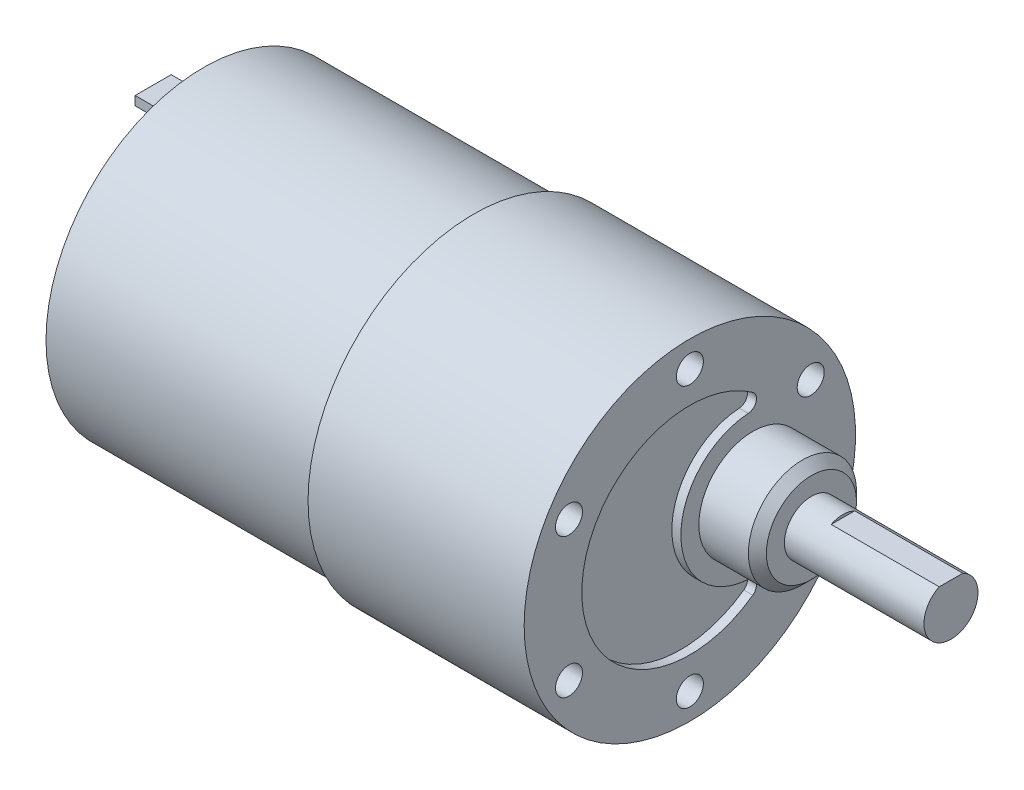
ISO-10303-21;
HEADER;
FILE_DESCRIPTION(('STEP AP214'),'2;1');
FILE_NAME('part.step','',(''),(''),'','','');
FILE_SCHEMA(('AUTOMOTIVE_DESIGN { 1 0 10303 214 1 1 1 1 }'));
ENDSEC;
DATA;
#1=APPLICATION_CONTEXT('core data for automotive mechanical design processes');
#2=APPLICATION_PROTOCOL_DEFINITION('international standard','automotive_design',2000,#1);
#3=PRODUCT_CONTEXT('',#1,'mechanical');
#4=PRODUCT('Part','Part','',(#3));
#5=PRODUCT_RELATED_PRODUCT_CATEGORY('part','',(#4));
#6=PRODUCT_DEFINITION_FORMATION('','',#4);
#7=PRODUCT_DEFINITION_CONTEXT('part definition',#1,'design');
#8=PRODUCT_DEFINITION('design','',#6,#7);
#9=PRODUCT_DEFINITION_SHAPE('','',#8);
#10=(LENGTH_UNIT() NAMED_UNIT(*) SI_UNIT(.MILLI.,.METRE.));
#11=(NAMED_UNIT(*) PLANE_ANGLE_UNIT() SI_UNIT($,.RADIAN.));
#12=(NAMED_UNIT(*) SI_UNIT($,.STERADIAN.) SOLID_ANGLE_UNIT());
#13=UNCERTAINTY_MEASURE_WITH_UNIT(LENGTH_MEASURE(1.E-05),#10,'distance_accuracy_value','');
#14=(GEOMETRIC_REPRESENTATION_CONTEXT(3) GLOBAL_UNCERTAINTY_ASSIGNED_CONTEXT((#13)) GLOBAL_UNIT_ASSIGNED_CONTEXT((#10,
#11,#12)) REPRESENTATION_CONTEXT('',''));
#15=CARTESIAN_POINT('',(0.,0.,0.));
#16=DIRECTION('',(0.,0.,1.));
#17=DIRECTION('',(1.,0.,0.));
#18=AXIS2_PLACEMENT_3D('',#15,#16,#17);
#19=CARTESIAN_POINT('',(54.,0.,-7.));
#20=DIRECTION('',(-1.,0.,0.));
#21=DIRECTION('',(0.,0.,1.));
#22=AXIS2_PLACEMENT_3D('',#19,#20,#21);
#23=CYLINDRICAL_SURFACE('',#22,3.);
#24=CARTESIAN_POINT('',(60.5,0.,-7.));
#25=DIRECTION('',(-1.,0.,0.));
#26=DIRECTION('',(0.,0.,1.));
#27=AXIS2_PLACEMENT_3D('',#24,#25,#26);
#28=CIRCLE('',#27,3.);
#29=CARTESIAN_POINT('',(60.5,0.,-4.));
#30=VERTEX_POINT('',#29);
#31=EDGE_CURVE('E254',#30,#30,#28,.T.);
#32=ORIENTED_EDGE('',*,*,#31,.F.);
#33=EDGE_LOOP('',(#32));
#34=FACE_BOUND('',#33,.T.);
#35=CARTESIAN_POINT('',(64.,0.,-7.));
#36=DIRECTION('',(1.,0.,0.));
#37=DIRECTION('',(0.,0.,-1.));
#38=AXIS2_PLACEMENT_3D('',#35,#36,#37);
#39=CIRCLE('',#38,3.);
#40=CARTESIAN_POINT('',(64.,2.7,-8.3076696830622));
#41=VERTEX_POINT('',#40);
#42=CARTESIAN_POINT('',(64.,2.7,-5.6923303169378));
#43=VERTEX_POINT('',#42);
#44=EDGE_CURVE('E12',#41,#43,#39,.T.);
#45=ORIENTED_EDGE('',*,*,#44,.F.);
#46=DIRECTION('',(1.,0.,0.));
#47=VECTOR('',#46,1.);
#48=CARTESIAN_POINT('',(64.,2.7,-8.3076696830622));
#49=LINE('',#48,#47);
#50=CARTESIAN_POINT('',(76.,2.7,-8.3076696830622));
#51=VERTEX_POINT('',#50);
#52=EDGE_CURVE('E134',#41,#51,#49,.T.);
#53=ORIENTED_EDGE('',*,*,#52,.T.);
#54=CARTESIAN_POINT('',(76.,0.,-7.));
#55=DIRECTION('',(-1.,0.,0.));
#56=DIRECTION('',(0.,0.,1.));
#57=AXIS2_PLACEMENT_3D('',#54,#55,#56);
#58=CIRCLE('',#57,3.);
#59=CARTESIAN_POINT('',(76.,2.7,-5.6923303169378));
#60=VERTEX_POINT('',#59);
#61=EDGE_CURVE('E147',#51,#60,#58,.T.);
#62=ORIENTED_EDGE('',*,*,#61,.T.);
#63=DIRECTION('',(1.,0.,0.));
#64=VECTOR('',#63,1.);
#65=CARTESIAN_POINT('',(64.,2.7,-5.6923303169378));
#66=LINE('',#65,#64);
#67=EDGE_CURVE('E49',#43,#60,#66,.T.);
#68=ORIENTED_EDGE('',*,*,#67,.F.);
#69=EDGE_LOOP('',(#45,#53,#62,#68));
#70=FACE_BOUND('',#69,.T.);
#71=ADVANCED_FACE('F34',(#34,#70),#23,.T.);
#72=CARTESIAN_POINT('',(76.,0.,-7.));
#73=DIRECTION('',(-1.,0.,0.));
#74=DIRECTION('',(0.,0.,1.));
#75=AXIS2_PLACEMENT_3D('',#72,#73,#74);
#76=PLANE('',#75);
#77=DIRECTION('',(0.,0.,1.));
#78=VECTOR('',#77,1.);
#79=CARTESIAN_POINT('',(76.,2.7,-5.6923303169378));
#80=LINE('',#79,#78);
#81=EDGE_CURVE('E138',#51,#60,#80,.T.);
#82=ORIENTED_EDGE('',*,*,#81,.T.);
#83=ORIENTED_EDGE('',*,*,#61,.F.);
#84=EDGE_LOOP('',(#82,#83));
#85=FACE_BOUND('',#84,.T.);
#86=ADVANCED_FACE('F327',(#85),#76,.F.);
#87=CARTESIAN_POINT('',(0.,0.,0.));
#88=DIRECTION('',(1.,0.,0.));
#89=DIRECTION('',(0.,0.,-1.));
#90=AXIS2_PLACEMENT_3D('',#87,#88,#89);
#91=PLANE('',#90);
#92=CARTESIAN_POINT('',(0.,0.,0.));
#93=DIRECTION('',(1.,0.,0.));
#94=DIRECTION('',(0.,1.,0.));
#95=AXIS2_PLACEMENT_3D('',#92,#93,#94);
#96=CIRCLE('',#95,5.);
#97=CARTESIAN_POINT('',(0.,5.,0.));
#98=VERTEX_POINT('',#97);
#99=EDGE_CURVE('E157',#98,#98,#96,.T.);
#100=ORIENTED_EDGE('',*,*,#99,.T.);
#101=EDGE_LOOP('',(#100));
#102=FACE_BOUND('',#101,.T.);
#103=DIRECTION('',(0.,1.,0.));
#104=VECTOR('',#103,1.);
#105=CARTESIAN_POINT('',(0.,12.,-2.));
#106=LINE('',#105,#104);
#107=CARTESIAN_POINT('',(0.,12.,-2.));
#108=VERTEX_POINT('',#107);
#109=CARTESIAN_POINT('',(0.,13.,-2.));
#110=VERTEX_POINT('',#109);
#111=EDGE_CURVE('E199',#108,#110,#106,.T.);
#112=ORIENTED_EDGE('',*,*,#111,.T.);
#113=DIRECTION('',(0.,0.,1.));
#114=VECTOR('',#113,1.);
#115=CARTESIAN_POINT('',(0.,13.,-2.));
#116=LINE('',#115,#114);
#117=CARTESIAN_POINT('',(0.,13.,2.));
#118=VERTEX_POINT('',#117);
#119=EDGE_CURVE('E211',#110,#118,#116,.T.);
#120=ORIENTED_EDGE('',*,*,#119,.T.);
#121=DIRECTION('',(0.,1.,0.));
#122=VECTOR('',#121,1.);
#123=CARTESIAN_POINT('',(0.,12.,2.));
#124=LINE('',#123,#122);
#125=CARTESIAN_POINT('',(0.,12.,2.));
#126=VERTEX_POINT('',#125);
#127=EDGE_CURVE('E183',#126,#118,#124,.T.);
#128=ORIENTED_EDGE('',*,*,#127,.F.);
#129=DIRECTION('',(0.,0.,1.));
#130=VECTOR('',#129,1.);
#131=CARTESIAN_POINT('',(0.,12.,-2.));
#132=LINE('',#131,#130);
#133=EDGE_CURVE('E212',#108,#126,#132,.T.);
#134=ORIENTED_EDGE('',*,*,#133,.F.);
#135=EDGE_LOOP('',(#112,#120,#128,#134));
#136=FACE_BOUND('',#135,.T.);
#137=CARTESIAN_POINT('',(0.,0.,0.));
#138=DIRECTION('',(-1.,0.,0.));
#139=DIRECTION('',(0.,0.,1.));
#140=AXIS2_PLACEMENT_3D('',#137,#138,#139);
#141=CIRCLE('',#140,17.5);
#142=CARTESIAN_POINT('',(0.,0.,17.5));
#143=VERTEX_POINT('',#142);
#144=EDGE_CURVE('E308',#143,#143,#141,.T.);
#145=ORIENTED_EDGE('',*,*,#144,.T.);
#146=EDGE_LOOP('',(#145));
#147=FACE_BOUND('',#146,.T.);
#148=DIRECTION('',(0.,1.,0.));
#149=VECTOR('',#148,1.);
#150=CARTESIAN_POINT('',(0.,-12.,-2.));
#151=LINE('',#150,#149);
#152=CARTESIAN_POINT('',(0.,-13.,-2.));
#153=VERTEX_POINT('',#152);
#154=CARTESIAN_POINT('',(0.,-12.,-2.));
#155=VERTEX_POINT('',#154);
#156=EDGE_CURVE('E176',#153,#155,#151,.T.);
#157=ORIENTED_EDGE('',*,*,#156,.T.);
#158=DIRECTION('',(0.,0.,1.));
#159=VECTOR('',#158,1.);
#160=CARTESIAN_POINT('',(0.,-12.,-2.));
#161=LINE('',#160,#159);
#162=CARTESIAN_POINT('',(0.,-12.,2.));
#163=VERTEX_POINT('',#162);
#164=EDGE_CURVE('E180',#155,#163,#161,.T.);
#165=ORIENTED_EDGE('',*,*,#164,.T.);
#166=DIRECTION('',(0.,1.,0.));
#167=VECTOR('',#166,1.);
#168=CARTESIAN_POINT('',(0.,-12.,2.));
#169=LINE('',#168,#167);
#170=CARTESIAN_POINT('',(0.,-13.,2.));
#171=VERTEX_POINT('',#170);
#172=EDGE_CURVE('E166',#171,#163,#169,.T.);
#173=ORIENTED_EDGE('',*,*,#172,.F.);
#174=DIRECTION('',(0.,0.,1.));
#175=VECTOR('',#174,1.);
#176=CARTESIAN_POINT('',(0.,-13.,-2.));
#177=LINE('',#176,#175);
#178=EDGE_CURVE('E184',#153,#171,#177,.T.);
#179=ORIENTED_EDGE('',*,*,#178,.F.);
#180=EDGE_LOOP('',(#157,#165,#173,#179));
#181=FACE_BOUND('',#180,.T.);
#182=ADVANCED_FACE('F36',(#102,#136,#147,#181),#91,.F.);
#183=CARTESIAN_POINT('',(54.,0.,0.));
#184=DIRECTION('',(-1.,0.,0.));
#185=DIRECTION('',(0.,0.,1.));
#186=AXIS2_PLACEMENT_3D('',#183,#184,#185);
#187=PLANE('',#186);
#188=CARTESIAN_POINT('',(54.,0.,0.));
#189=DIRECTION('',(1.,0.,0.));
#190=DIRECTION('',(0.,0.,-1.));
#191=AXIS2_PLACEMENT_3D('',#188,#189,#190);
#192=CIRCLE('',#191,12.);
#193=CARTESIAN_POINT('',(54.,9.75538041620434,-6.98802925975106));
#194=VERTEX_POINT('',#193);
#195=CARTESIAN_POINT('',(54.,-9.75538041620434,-6.98802925975105));
#196=VERTEX_POINT('',#195);
#197=EDGE_CURVE('E237',#194,#196,#192,.T.);
#198=ORIENTED_EDGE('',*,*,#197,.F.);
#199=CARTESIAN_POINT('',(54.,8.95978259912353,-6.41812213285728));
#200=DIRECTION('',(1.,0.,0.));
#201=DIRECTION('',(0.,0.,-1.));
#202=AXIS2_PLACEMENT_3D('',#199,#200,#201);
#203=CIRCLE('',#202,0.978657253499951);
#204=CARTESIAN_POINT('',(54.,7.98318264850209,-6.48154575837861));
#205=VERTEX_POINT('',#204);
#206=EDGE_CURVE('E215',#205,#194,#203,.T.);
#207=ORIENTED_EDGE('',*,*,#206,.F.);
#208=CARTESIAN_POINT('',(54.,0.,-7.));
#209=DIRECTION('',(-1.,0.,0.));
#210=DIRECTION('',(0.,0.,-1.));
#211=AXIS2_PLACEMENT_3D('',#208,#209,#210);
#212=CIRCLE('',#211,8.);
#213=CARTESIAN_POINT('',(54.,-7.98318264850209,-6.48154575837861));
#214=VERTEX_POINT('',#213);
#215=EDGE_CURVE('E226',#214,#205,#212,.T.);
#216=ORIENTED_EDGE('',*,*,#215,.F.);
#217=CARTESIAN_POINT('',(54.,-8.95978259912353,-6.41812213285728));
#218=DIRECTION('',(1.,0.,0.));
#219=DIRECTION('',(0.,0.,-1.));
#220=AXIS2_PLACEMENT_3D('',#217,#218,#219);
#221=CIRCLE('',#220,0.978657253499951);
#222=EDGE_CURVE('E240',#196,#214,#221,.T.);
#223=ORIENTED_EDGE('',*,*,#222,.F.);
#224=EDGE_LOOP('',(#198,#207,#216,#223));
#225=FACE_BOUND('',#224,.T.);
#226=CARTESIAN_POINT('',(54.,0.,0.));
#227=DIRECTION('',(-1.,0.,0.));
#228=DIRECTION('',(0.,0.,1.));
#229=AXIS2_PLACEMENT_3D('',#226,#227,#228);
#230=CIRCLE('',#229,18.4);
#231=CARTESIAN_POINT('',(54.,0.,18.4));
#232=VERTEX_POINT('',#231);
#233=EDGE_CURVE('E297',#232,#232,#230,.T.);
#234=ORIENTED_EDGE('',*,*,#233,.F.);
#235=EDGE_LOOP('',(#234));
#236=FACE_BOUND('',#235,.T.);
#237=CARTESIAN_POINT('',(54.,15.5,0.));
#238=DIRECTION('',(1.,0.,0.));
#239=DIRECTION('',(0.,0.,-1.));
#240=AXIS2_PLACEMENT_3D('',#237,#238,#239);
#241=CIRCLE('',#240,1.5);
#242=CARTESIAN_POINT('',(54.,15.5,-1.5));
#243=VERTEX_POINT('',#242);
#244=EDGE_CURVE('E291',#243,#243,#241,.T.);
#245=ORIENTED_EDGE('',*,*,#244,.F.);
#246=EDGE_LOOP('',(#245));
#247=FACE_BOUND('',#246,.T.);
#248=CARTESIAN_POINT('',(54.,7.74999999999997,-13.4233937586588));
#249=DIRECTION('',(1.,0.,0.));
#250=DIRECTION('',(0.,0.,-1.));
#251=AXIS2_PLACEMENT_3D('',#248,#249,#250);
#252=CIRCLE('',#251,1.5);
#253=CARTESIAN_POINT('',(54.,7.74999999999997,-14.9233937586588));
#254=VERTEX_POINT('',#253);
#255=EDGE_CURVE('E285',#254,#254,#252,.T.);
#256=ORIENTED_EDGE('',*,*,#255,.F.);
#257=EDGE_LOOP('',(#256));
#258=FACE_BOUND('',#257,.T.);
#259=CARTESIAN_POINT('',(54.,-7.74999999999981,-13.4233937586591));
#260=DIRECTION('',(1.,0.,0.));
#261=DIRECTION('',(0.,0.,-1.));
#262=AXIS2_PLACEMENT_3D('',#259,#260,#261);
#263=CIRCLE('',#262,1.50000000000033);
#264=CARTESIAN_POINT('',(54.,-7.74999999999981,-14.9233937586595));
#265=VERTEX_POINT('',#264);
#266=EDGE_CURVE('E279',#265,#265,#263,.T.);
#267=ORIENTED_EDGE('',*,*,#266,.F.);
#268=EDGE_LOOP('',(#267));
#269=FACE_BOUND('',#268,.T.);
#270=CARTESIAN_POINT('',(54.,-15.5,-4.40689225054305E-13));
#271=DIRECTION('',(1.,0.,0.));
#272=DIRECTION('',(0.,0.,-1.));
#273=AXIS2_PLACEMENT_3D('',#270,#271,#272);
#274=CIRCLE('',#273,1.50000000000052);
#275=CARTESIAN_POINT('',(54.,-15.5,-1.50000000000097));
#276=VERTEX_POINT('',#275);
#277=EDGE_CURVE('E273',#276,#276,#274,.T.);
#278=ORIENTED_EDGE('',*,*,#277,.F.);
#279=EDGE_LOOP('',(#278));
#280=FACE_BOUND('',#279,.T.);
#281=CARTESIAN_POINT('',(54.,-7.7500000000002,13.4233937586585));
#282=DIRECTION('',(1.,0.,0.));
#283=DIRECTION('',(0.,0.,-1.));
#284=AXIS2_PLACEMENT_3D('',#281,#282,#283);
#285=CIRCLE('',#284,1.50000000000051);
#286=CARTESIAN_POINT('',(54.,-7.7500000000002,11.923393758658));
#287=VERTEX_POINT('',#286);
#288=EDGE_CURVE('E267',#287,#287,#285,.T.);
#289=ORIENTED_EDGE('',*,*,#288,.F.);
#290=EDGE_LOOP('',(#289));
#291=FACE_BOUND('',#290,.T.);
#292=CARTESIAN_POINT('',(54.,7.75000000000016,13.4233937586587));
#293=DIRECTION('',(1.,0.,0.));
#294=DIRECTION('',(0.,0.,-1.));
#295=AXIS2_PLACEMENT_3D('',#292,#293,#294);
#296=CIRCLE('',#295,1.5);
#297=CARTESIAN_POINT('',(54.,7.75000000000016,11.9233937586587));
#298=VERTEX_POINT('',#297);
#299=EDGE_CURVE('E263',#298,#298,#296,.T.);
#300=ORIENTED_EDGE('',*,*,#299,.F.);
#301=EDGE_LOOP('',(#300));
#302=FACE_BOUND('',#301,.T.);
#303=CARTESIAN_POINT('',(54.,0.,-7.));
#304=DIRECTION('',(-1.,0.,0.));
#305=DIRECTION('',(0.,0.,1.));
#306=AXIS2_PLACEMENT_3D('',#303,#304,#305);
#307=CIRCLE('',#306,6.);
#308=CARTESIAN_POINT('',(54.,0.,-0.999999999999996));
#309=VERTEX_POINT('',#308);
#310=EDGE_CURVE('E42',#309,#309,#307,.F.);
#311=ORIENTED_EDGE('',*,*,#310,.F.);
#312=EDGE_LOOP('',(#311));
#313=FACE_BOUND('',#312,.T.);
#314=ADVANCED_FACE('F316',(#225,#236,#247,#258,#269,#280,#291,#302,#313),#187,.F.);
#315=CARTESIAN_POINT('',(0.,0.,0.));
#316=DIRECTION('',(-1.,0.,0.));
#317=DIRECTION('',(0.,0.,1.));
#318=AXIS2_PLACEMENT_3D('',#315,#316,#317);
#319=CYLINDRICAL_SURFACE('',#318,17.5);
#320=ORIENTED_EDGE('',*,*,#144,.F.);
#321=EDGE_LOOP('',(#320));
#322=FACE_BOUND('',#321,.T.);
#323=CARTESIAN_POINT('',(30.,0.,0.));
#324=DIRECTION('',(-1.,0.,0.));
#325=DIRECTION('',(0.,0.,1.));
#326=AXIS2_PLACEMENT_3D('',#323,#324,#325);
#327=CIRCLE('',#326,17.5);
#328=CARTESIAN_POINT('',(30.,0.,17.5));
#329=VERTEX_POINT('',#328);
#330=EDGE_CURVE('E305',#329,#329,#327,.T.);
#331=ORIENTED_EDGE('',*,*,#330,.T.);
#332=EDGE_LOOP('',(#331));
#333=FACE_BOUND('',#332,.T.);
#334=ADVANCED_FACE('F318',(#322,#333),#319,.T.);
#335=CARTESIAN_POINT('',(30.,17.5,0.));
#336=DIRECTION('',(1.,0.,0.));
#337=DIRECTION('',(0.,0.,-1.));
#338=AXIS2_PLACEMENT_3D('',#335,#336,#337);
#339=PLANE('',#338);
#340=ORIENTED_EDGE('',*,*,#330,.F.);
#341=EDGE_LOOP('',(#340));
#342=FACE_BOUND('',#341,.T.);
#343=CARTESIAN_POINT('',(30.,0.,0.));
#344=DIRECTION('',(-1.,0.,0.));
#345=DIRECTION('',(0.,0.,1.));
#346=AXIS2_PLACEMENT_3D('',#343,#344,#345);
#347=CIRCLE('',#346,18.4);
#348=CARTESIAN_POINT('',(30.,0.,18.4));
#349=VERTEX_POINT('',#348);
#350=EDGE_CURVE('E302',#349,#349,#347,.T.);
#351=ORIENTED_EDGE('',*,*,#350,.T.);
#352=EDGE_LOOP('',(#351));
#353=FACE_BOUND('',#352,.T.);
#354=ADVANCED_FACE('F325',(#342,#353),#339,.F.);
#355=CARTESIAN_POINT('',(0.,0.,0.));
#356=DIRECTION('',(-1.,0.,0.));
#357=DIRECTION('',(0.,0.,1.));
#358=AXIS2_PLACEMENT_3D('',#355,#356,#357);
#359=CYLINDRICAL_SURFACE('',#358,18.4);
#360=ORIENTED_EDGE('',*,*,#350,.F.);
#361=EDGE_LOOP('',(#360));
#362=FACE_BOUND('',#361,.T.);
#363=ORIENTED_EDGE('',*,*,#233,.T.);
#364=EDGE_LOOP('',(#363));
#365=FACE_BOUND('',#364,.T.);
#366=ADVANCED_FACE('F400',(#362,#365),#359,.T.);
#367=CARTESIAN_POINT('',(44.,15.5,0.));
#368=DIRECTION('',(1.,0.,0.));
#369=DIRECTION('',(0.,0.,-1.));
#370=AXIS2_PLACEMENT_3D('',#367,#368,#369);
#371=CYLINDRICAL_SURFACE('',#370,1.5);
#372=CARTESIAN_POINT('',(44.,15.5,0.));
#373=DIRECTION('',(1.,0.,0.));
#374=DIRECTION('',(0.,0.,-1.));
#375=AXIS2_PLACEMENT_3D('',#372,#373,#374);
#376=CIRCLE('',#375,1.5);
#377=CARTESIAN_POINT('',(44.,15.5,-1.5));
#378=VERTEX_POINT('',#377);
#379=EDGE_CURVE('E294',#378,#378,#376,.T.);
#380=ORIENTED_EDGE('',*,*,#379,.F.);
#381=EDGE_LOOP('',(#380));
#382=FACE_BOUND('',#381,.T.);
#383=ORIENTED_EDGE('',*,*,#244,.T.);
#384=EDGE_LOOP('',(#383));
#385=FACE_BOUND('',#384,.T.);
#386=ADVANCED_FACE('F397',(#382,#385),#371,.F.);
#387=CARTESIAN_POINT('',(44.,15.5,0.));
#388=DIRECTION('',(1.,0.,0.));
#389=DIRECTION('',(0.,0.,-1.));
#390=AXIS2_PLACEMENT_3D('',#387,#388,#389);
#391=PLANE('',#390);
#392=ORIENTED_EDGE('',*,*,#379,.T.);
#393=EDGE_LOOP('',(#392));
#394=FACE_BOUND('',#393,.T.);
#395=ADVANCED_FACE('F394',(#394),#391,.T.);
#396=CARTESIAN_POINT('',(44.,7.74999999999997,-13.4233937586588));
#397=DIRECTION('',(1.,0.,0.));
#398=DIRECTION('',(0.,0.,-1.));
#399=AXIS2_PLACEMENT_3D('',#396,#397,#398);
#400=CYLINDRICAL_SURFACE('',#399,1.5);
#401=CARTESIAN_POINT('',(44.,7.74999999999997,-13.4233937586588));
#402=DIRECTION('',(1.,0.,0.));
#403=DIRECTION('',(0.,0.,-1.));
#404=AXIS2_PLACEMENT_3D('',#401,#402,#403);
#405=CIRCLE('',#404,1.5);
#406=CARTESIAN_POINT('',(44.,7.74999999999997,-14.9233937586588));
#407=VERTEX_POINT('',#406);
#408=EDGE_CURVE('E288',#407,#407,#405,.T.);
#409=ORIENTED_EDGE('',*,*,#408,.F.);
#410=EDGE_LOOP('',(#409));
#411=FACE_BOUND('',#410,.T.);
#412=ORIENTED_EDGE('',*,*,#255,.T.);
#413=EDGE_LOOP('',(#412));
#414=FACE_BOUND('',#413,.T.);
#415=ADVANCED_FACE('F390',(#411,#414),#400,.F.);
#416=CARTESIAN_POINT('',(44.,7.74999999999997,-13.4233937586588));
#417=DIRECTION('',(1.,0.,0.));
#418=DIRECTION('',(0.,0.,-1.));
#419=AXIS2_PLACEMENT_3D('',#416,#417,#418);
#420=PLANE('',#419);
#421=ORIENTED_EDGE('',*,*,#408,.T.);
#422=EDGE_LOOP('',(#421));
#423=FACE_BOUND('',#422,.T.);
#424=ADVANCED_FACE('F386',(#423),#420,.T.);
#425=CARTESIAN_POINT('',(44.,-7.74999999999981,-13.4233937586591));
#426=DIRECTION('',(1.,0.,0.));
#427=DIRECTION('',(0.,0.,-1.));
#428=AXIS2_PLACEMENT_3D('',#425,#426,#427);
#429=CYLINDRICAL_SURFACE('',#428,1.50000000000033);
#430=CARTESIAN_POINT('',(44.,-7.74999999999981,-13.4233937586591));
#431=DIRECTION('',(1.,0.,0.));
#432=DIRECTION('',(0.,0.,-1.));
#433=AXIS2_PLACEMENT_3D('',#430,#431,#432);
#434=CIRCLE('',#433,1.50000000000033);
#435=CARTESIAN_POINT('',(44.,-7.74999999999981,-14.9233937586595));
#436=VERTEX_POINT('',#435);
#437=EDGE_CURVE('E282',#436,#436,#434,.T.);
#438=ORIENTED_EDGE('',*,*,#437,.F.);
#439=EDGE_LOOP('',(#438));
#440=FACE_BOUND('',#439,.T.);
#441=ORIENTED_EDGE('',*,*,#266,.T.);
#442=EDGE_LOOP('',(#441));
#443=FACE_BOUND('',#442,.T.);
#444=ADVANCED_FACE('F382',(#440,#443),#429,.F.);
#445=CARTESIAN_POINT('',(44.,-7.74999999999981,-13.4233937586591));
#446=DIRECTION('',(1.,0.,0.));
#447=DIRECTION('',(0.,0.,-1.));
#448=AXIS2_PLACEMENT_3D('',#445,#446,#447);
#449=PLANE('',#448);
#450=ORIENTED_EDGE('',*,*,#437,.T.);
#451=EDGE_LOOP('',(#450));
#452=FACE_BOUND('',#451,.T.);
#453=ADVANCED_FACE('F378',(#452),#449,.T.);
#454=CARTESIAN_POINT('',(44.,-15.5,-4.40689225054305E-13));
#455=DIRECTION('',(1.,0.,0.));
#456=DIRECTION('',(0.,0.,-1.));
#457=AXIS2_PLACEMENT_3D('',#454,#455,#456);
#458=CYLINDRICAL_SURFACE('',#457,1.50000000000052);
#459=CARTESIAN_POINT('',(44.,-15.5,-4.40689225054305E-13));
#460=DIRECTION('',(1.,0.,0.));
#461=DIRECTION('',(0.,0.,-1.));
#462=AXIS2_PLACEMENT_3D('',#459,#460,#461);
#463=CIRCLE('',#462,1.50000000000052);
#464=CARTESIAN_POINT('',(44.,-15.5,-1.50000000000097));
#465=VERTEX_POINT('',#464);
#466=EDGE_CURVE('E276',#465,#465,#463,.T.);
#467=ORIENTED_EDGE('',*,*,#466,.F.);
#468=EDGE_LOOP('',(#467));
#469=FACE_BOUND('',#468,.T.);
#470=ORIENTED_EDGE('',*,*,#277,.T.);
#471=EDGE_LOOP('',(#470));
#472=FACE_BOUND('',#471,.T.);
#473=ADVANCED_FACE('F374',(#469,#472),#458,.F.);
#474=CARTESIAN_POINT('',(44.,-15.5,-4.40689225054305E-13));
#475=DIRECTION('',(1.,0.,0.));
#476=DIRECTION('',(0.,0.,-1.));
#477=AXIS2_PLACEMENT_3D('',#474,#475,#476);
#478=PLANE('',#477);
#479=ORIENTED_EDGE('',*,*,#466,.T.);
#480=EDGE_LOOP('',(#479));
#481=FACE_BOUND('',#480,.T.);
#482=ADVANCED_FACE('F370',(#481),#478,.T.);
#483=CARTESIAN_POINT('',(44.,-7.7500000000002,13.4233937586585));
#484=DIRECTION('',(1.,0.,0.));
#485=DIRECTION('',(0.,0.,-1.));
#486=AXIS2_PLACEMENT_3D('',#483,#484,#485);
#487=CYLINDRICAL_SURFACE('',#486,1.50000000000051);
#488=CARTESIAN_POINT('',(44.,-7.7500000000002,13.4233937586585));
#489=DIRECTION('',(1.,0.,0.));
#490=DIRECTION('',(0.,0.,-1.));
#491=AXIS2_PLACEMENT_3D('',#488,#489,#490);
#492=CIRCLE('',#491,1.50000000000051);
#493=CARTESIAN_POINT('',(44.,-7.7500000000002,11.923393758658));
#494=VERTEX_POINT('',#493);
#495=EDGE_CURVE('E270',#494,#494,#492,.T.);
#496=ORIENTED_EDGE('',*,*,#495,.F.);
#497=EDGE_LOOP('',(#496));
#498=FACE_BOUND('',#497,.T.);
#499=ORIENTED_EDGE('',*,*,#288,.T.);
#500=EDGE_LOOP('',(#499));
#501=FACE_BOUND('',#500,.T.);
#502=ADVANCED_FACE('F366',(#498,#501),#487,.F.);
#503=CARTESIAN_POINT('',(44.,-7.7500000000002,13.4233937586585));
#504=DIRECTION('',(1.,0.,0.));
#505=DIRECTION('',(0.,0.,-1.));
#506=AXIS2_PLACEMENT_3D('',#503,#504,#505);
#507=PLANE('',#506);
#508=ORIENTED_EDGE('',*,*,#495,.T.);
#509=EDGE_LOOP('',(#508));
#510=FACE_BOUND('',#509,.T.);
#511=ADVANCED_FACE('F362',(#510),#507,.T.);
#512=CARTESIAN_POINT('',(44.,7.75000000000016,13.4233937586587));
#513=DIRECTION('',(1.,0.,0.));
#514=DIRECTION('',(0.,0.,-1.));
#515=AXIS2_PLACEMENT_3D('',#512,#513,#514);
#516=CYLINDRICAL_SURFACE('',#515,1.5);
#517=CARTESIAN_POINT('',(44.,7.75000000000016,13.4233937586587));
#518=DIRECTION('',(1.,0.,0.));
#519=DIRECTION('',(0.,0.,-1.));
#520=AXIS2_PLACEMENT_3D('',#517,#518,#519);
#521=CIRCLE('',#520,1.5);
#522=CARTESIAN_POINT('',(44.,7.75000000000016,11.9233937586587));
#523=VERTEX_POINT('',#522);
#524=EDGE_CURVE('E264',#523,#523,#521,.T.);
#525=ORIENTED_EDGE('',*,*,#524,.F.);
#526=EDGE_LOOP('',(#525));
#527=FACE_BOUND('',#526,.T.);
#528=ORIENTED_EDGE('',*,*,#299,.T.);
#529=EDGE_LOOP('',(#528));
#530=FACE_BOUND('',#529,.T.);
#531=ADVANCED_FACE('F358',(#527,#530),#516,.F.);
#532=CARTESIAN_POINT('',(44.,7.75000000000016,13.4233937586587));
#533=DIRECTION('',(1.,0.,0.));
#534=DIRECTION('',(0.,0.,-1.));
#535=AXIS2_PLACEMENT_3D('',#532,#533,#534);
#536=PLANE('',#535);
#537=ORIENTED_EDGE('',*,*,#524,.T.);
#538=EDGE_LOOP('',(#537));
#539=FACE_BOUND('',#538,.T.);
#540=ADVANCED_FACE('F355',(#539),#536,.T.);
#541=CARTESIAN_POINT('',(54.,0.,-7.));
#542=DIRECTION('',(-1.,0.,0.));
#543=DIRECTION('',(0.,0.,1.));
#544=AXIS2_PLACEMENT_3D('',#541,#542,#543);
#545=CYLINDRICAL_SURFACE('',#544,6.);
#546=ORIENTED_EDGE('',*,*,#310,.T.);
#547=EDGE_LOOP('',(#546));
#548=FACE_BOUND('',#547,.T.);
#549=CARTESIAN_POINT('',(59.5,0.,-7.));
#550=DIRECTION('',(-1.,0.,0.));
#551=DIRECTION('',(0.,0.,1.));
#552=AXIS2_PLACEMENT_3D('',#549,#550,#551);
#553=CIRCLE('',#552,6.);
#554=CARTESIAN_POINT('',(59.5,0.,-0.999999999999996));
#555=VERTEX_POINT('',#554);
#556=EDGE_CURVE('E260',#555,#555,#553,.T.);
#557=ORIENTED_EDGE('',*,*,#556,.T.);
#558=EDGE_LOOP('',(#557));
#559=FACE_BOUND('',#558,.T.);
#560=ADVANCED_FACE('F313',(#548,#559),#545,.T.);
#561=CARTESIAN_POINT('',(60.5,0.,-7.));
#562=DIRECTION('',(-1.,0.,0.));
#563=DIRECTION('',(0.,0.,1.));
#564=AXIS2_PLACEMENT_3D('',#561,#562,#563);
#565=CONICAL_SURFACE('',#564,5.,0.785398163397449);
#566=ORIENTED_EDGE('',*,*,#556,.F.);
#567=EDGE_LOOP('',(#566));
#568=FACE_BOUND('',#567,.T.);
#569=CARTESIAN_POINT('',(60.5,0.,-7.));
#570=DIRECTION('',(-1.,0.,0.));
#571=DIRECTION('',(0.,0.,1.));
#572=AXIS2_PLACEMENT_3D('',#569,#570,#571);
#573=CIRCLE('',#572,5.);
#574=CARTESIAN_POINT('',(60.5,0.,-2.));
#575=VERTEX_POINT('',#574);
#576=EDGE_CURVE('E257',#575,#575,#573,.T.);
#577=ORIENTED_EDGE('',*,*,#576,.T.);
#578=EDGE_LOOP('',(#577));
#579=FACE_BOUND('',#578,.T.);
#580=ADVANCED_FACE('F348',(#568,#579),#565,.T.);
#581=CARTESIAN_POINT('',(60.5,0.,-12.));
#582=DIRECTION('',(-1.,0.,0.));
#583=DIRECTION('',(0.,0.,1.));
#584=AXIS2_PLACEMENT_3D('',#581,#582,#583);
#585=PLANE('',#584);
#586=ORIENTED_EDGE('',*,*,#576,.F.);
#587=EDGE_LOOP('',(#586));
#588=FACE_BOUND('',#587,.T.);
#589=ORIENTED_EDGE('',*,*,#31,.T.);
#590=EDGE_LOOP('',(#589));
#591=FACE_BOUND('',#590,.T.);
#592=ADVANCED_FACE('F344',(#588,#591),#585,.F.);
#593=CARTESIAN_POINT('',(53.,8.95978259912353,-6.41812213285728));
#594=DIRECTION('',(1.,0.,0.));
#595=DIRECTION('',(0.,0.,-1.));
#596=AXIS2_PLACEMENT_3D('',#593,#594,#595);
#597=CYLINDRICAL_SURFACE('',#596,0.978657253499951);
#598=ORIENTED_EDGE('',*,*,#206,.T.);
#599=DIRECTION('',(1.,0.,0.));
#600=VECTOR('',#599,1.);
#601=CARTESIAN_POINT('',(53.,9.75538041620434,-6.98802925975106));
#602=LINE('',#601,#600);
#603=CARTESIAN_POINT('',(53.,9.75538041620434,-6.98802925975106));
#604=VERTEX_POINT('',#603);
#605=EDGE_CURVE('E235',#604,#194,#602,.T.);
#606=ORIENTED_EDGE('',*,*,#605,.F.);
#607=CARTESIAN_POINT('',(53.,8.95978259912353,-6.41812213285728));
#608=DIRECTION('',(1.,0.,0.));
#609=DIRECTION('',(0.,0.,-1.));
#610=AXIS2_PLACEMENT_3D('',#607,#608,#609);
#611=CIRCLE('',#610,0.978657253499951);
#612=CARTESIAN_POINT('',(53.,7.98318264850209,-6.48154575837861));
#613=VERTEX_POINT('',#612);
#614=EDGE_CURVE('E222',#613,#604,#611,.T.);
#615=ORIENTED_EDGE('',*,*,#614,.F.);
#616=DIRECTION('',(1.,0.,0.));
#617=VECTOR('',#616,1.);
#618=CARTESIAN_POINT('',(53.,7.98318264850209,-6.48154575837861));
#619=LINE('',#618,#617);
#620=EDGE_CURVE('E245',#613,#205,#619,.T.);
#621=ORIENTED_EDGE('',*,*,#620,.T.);
#622=EDGE_LOOP('',(#598,#606,#615,#621));
#623=FACE_BOUND('',#622,.T.);
#624=ADVANCED_FACE('F347',(#623),#597,.F.);
#625=CARTESIAN_POINT('',(53.,0.,-7.));
#626=DIRECTION('',(1.,0.,0.));
#627=DIRECTION('',(0.,0.,-1.));
#628=AXIS2_PLACEMENT_3D('',#625,#626,#627);
#629=CYLINDRICAL_SURFACE('',#628,8.);
#630=ORIENTED_EDGE('',*,*,#215,.T.);
#631=ORIENTED_EDGE('',*,*,#620,.F.);
#632=CARTESIAN_POINT('',(53.,0.,-7.));
#633=DIRECTION('',(-1.,0.,0.));
#634=DIRECTION('',(0.,0.,-1.));
#635=AXIS2_PLACEMENT_3D('',#632,#633,#634);
#636=CIRCLE('',#635,8.);
#637=CARTESIAN_POINT('',(53.,-7.98318264850209,-6.48154575837861));
#638=VERTEX_POINT('',#637);
#639=EDGE_CURVE('E232',#638,#613,#636,.T.);
#640=ORIENTED_EDGE('',*,*,#639,.F.);
#641=DIRECTION('',(1.,0.,0.));
#642=VECTOR('',#641,1.);
#643=CARTESIAN_POINT('',(53.,-7.98318264850209,-6.48154575837861));
#644=LINE('',#643,#642);
#645=EDGE_CURVE('E247',#638,#214,#644,.T.);
#646=ORIENTED_EDGE('',*,*,#645,.T.);
#647=EDGE_LOOP('',(#630,#631,#640,#646));
#648=FACE_BOUND('',#647,.T.);
#649=ADVANCED_FACE('F536',(#648),#629,.T.);
#650=CARTESIAN_POINT('',(53.,-8.95978259912353,-6.41812213285728));
#651=DIRECTION('',(1.,0.,0.));
#652=DIRECTION('',(0.,0.,-1.));
#653=AXIS2_PLACEMENT_3D('',#650,#651,#652);
#654=CYLINDRICAL_SURFACE('',#653,0.978657253499951);
#655=ORIENTED_EDGE('',*,*,#222,.T.);
#656=ORIENTED_EDGE('',*,*,#645,.F.);
#657=CARTESIAN_POINT('',(53.,-8.95978259912353,-6.41812213285728));
#658=DIRECTION('',(1.,0.,0.));
#659=DIRECTION('',(0.,0.,-1.));
#660=AXIS2_PLACEMENT_3D('',#657,#658,#659);
#661=CIRCLE('',#660,0.978657253499951);
#662=CARTESIAN_POINT('',(53.,-9.75538041620434,-6.98802925975105));
#663=VERTEX_POINT('',#662);
#664=EDGE_CURVE('E229',#663,#638,#661,.T.);
#665=ORIENTED_EDGE('',*,*,#664,.F.);
#666=DIRECTION('',(1.,0.,0.));
#667=VECTOR('',#666,1.);
#668=CARTESIAN_POINT('',(53.,-9.75538041620434,-6.98802925975105));
#669=LINE('',#668,#667);
#670=EDGE_CURVE('E249',#663,#196,#669,.T.);
#671=ORIENTED_EDGE('',*,*,#670,.T.);
#672=EDGE_LOOP('',(#655,#656,#665,#671));
#673=FACE_BOUND('',#672,.T.);
#674=ADVANCED_FACE('F544',(#673),#654,.F.);
#675=CARTESIAN_POINT('',(53.,0.,0.));
#676=DIRECTION('',(1.,0.,0.));
#677=DIRECTION('',(0.,0.,-1.));
#678=AXIS2_PLACEMENT_3D('',#675,#676,#677);
#679=CYLINDRICAL_SURFACE('',#678,12.);
#680=ORIENTED_EDGE('',*,*,#197,.T.);
#681=ORIENTED_EDGE('',*,*,#670,.F.);
#682=CARTESIAN_POINT('',(53.,0.,0.));
#683=DIRECTION('',(1.,0.,0.));
#684=DIRECTION('',(0.,0.,-1.));
#685=AXIS2_PLACEMENT_3D('',#682,#683,#684);
#686=CIRCLE('',#685,12.);
#687=EDGE_CURVE('E225',#604,#663,#686,.T.);
#688=ORIENTED_EDGE('',*,*,#687,.F.);
#689=ORIENTED_EDGE('',*,*,#605,.T.);
#690=EDGE_LOOP('',(#680,#681,#688,#689));
#691=FACE_BOUND('',#690,.T.);
#692=ADVANCED_FACE('F553',(#691),#679,.F.);
#693=CARTESIAN_POINT('',(53.,4.47989129956176,-3.20906106642864));
#694=DIRECTION('',(1.,0.,0.));
#695=DIRECTION('',(0.,0.,-1.));
#696=AXIS2_PLACEMENT_3D('',#693,#694,#695);
#697=PLANE('',#696);
#698=ORIENTED_EDGE('',*,*,#614,.T.);
#699=ORIENTED_EDGE('',*,*,#687,.T.);
#700=ORIENTED_EDGE('',*,*,#664,.T.);
#701=ORIENTED_EDGE('',*,*,#639,.T.);
#702=EDGE_LOOP('',(#698,#699,#700,#701));
#703=FACE_BOUND('',#702,.T.);
#704=ADVANCED_FACE('F562',(#703),#697,.T.);
#705=CARTESIAN_POINT('',(0.,12.,-2.));
#706=DIRECTION('',(0.,-1.,0.));
#707=DIRECTION('',(0.,0.,-1.));
#708=AXIS2_PLACEMENT_3D('',#705,#706,#707);
#709=PLANE('',#708);
#710=ORIENTED_EDGE('',*,*,#133,.T.);
#711=DIRECTION('',(1.,0.,0.));
#712=VECTOR('',#711,1.);
#713=CARTESIAN_POINT('',(0.,12.,2.));
#714=LINE('',#713,#712);
#715=CARTESIAN_POINT('',(-5.6,12.,2.));
#716=VERTEX_POINT('',#715);
#717=EDGE_CURVE('E197',#716,#126,#714,.T.);
#718=ORIENTED_EDGE('',*,*,#717,.F.);
#719=DIRECTION('',(0.,0.,1.));
#720=VECTOR('',#719,1.);
#721=CARTESIAN_POINT('',(-5.6,12.,-2.));
#722=LINE('',#721,#720);
#723=CARTESIAN_POINT('',(-5.6,12.,-2.));
#724=VERTEX_POINT('',#723);
#725=EDGE_CURVE('E216',#724,#716,#722,.T.);
#726=ORIENTED_EDGE('',*,*,#725,.F.);
#727=DIRECTION('',(1.,0.,0.));
#728=VECTOR('',#727,1.);
#729=CARTESIAN_POINT('',(0.,12.,-2.));
#730=LINE('',#729,#728);
#731=EDGE_CURVE('E208',#724,#108,#730,.T.);
#732=ORIENTED_EDGE('',*,*,#731,.T.);
#733=EDGE_LOOP('',(#710,#718,#726,#732));
#734=FACE_BOUND('',#733,.T.);
#735=ADVANCED_FACE('F571',(#734),#709,.T.);
#736=CARTESIAN_POINT('',(-5.6,12.,-2.));
#737=DIRECTION('',(-1.,0.,0.));
#738=DIRECTION('',(0.,0.,1.));
#739=AXIS2_PLACEMENT_3D('',#736,#737,#738);
#740=PLANE('',#739);
#741=ORIENTED_EDGE('',*,*,#725,.T.);
#742=DIRECTION('',(0.,-1.,0.));
#743=VECTOR('',#742,1.);
#744=CARTESIAN_POINT('',(-5.6,12.,2.));
#745=LINE('',#744,#743);
#746=CARTESIAN_POINT('',(-5.6,13.,2.));
#747=VERTEX_POINT('',#746);
#748=EDGE_CURVE('E194',#747,#716,#745,.T.);
#749=ORIENTED_EDGE('',*,*,#748,.F.);
#750=DIRECTION('',(0.,0.,1.));
#751=VECTOR('',#750,1.);
#752=CARTESIAN_POINT('',(-5.6,13.,-2.));
#753=LINE('',#752,#751);
#754=CARTESIAN_POINT('',(-5.6,13.,-2.));
#755=VERTEX_POINT('',#754);
#756=EDGE_CURVE('E218',#755,#747,#753,.T.);
#757=ORIENTED_EDGE('',*,*,#756,.F.);
#758=DIRECTION('',(0.,-1.,0.));
#759=VECTOR('',#758,1.);
#760=CARTESIAN_POINT('',(-5.6,12.,-2.));
#761=LINE('',#760,#759);
#762=EDGE_CURVE('E205',#755,#724,#761,.T.);
#763=ORIENTED_EDGE('',*,*,#762,.T.);
#764=EDGE_LOOP('',(#741,#749,#757,#763));
#765=FACE_BOUND('',#764,.T.);
#766=ADVANCED_FACE('F587',(#765),#740,.T.);
#767=CARTESIAN_POINT('',(0.,13.,-2.));
#768=DIRECTION('',(0.,1.,0.));
#769=DIRECTION('',(0.,0.,1.));
#770=AXIS2_PLACEMENT_3D('',#767,#768,#769);
#771=PLANE('',#770);
#772=ORIENTED_EDGE('',*,*,#756,.T.);
#773=DIRECTION('',(-1.,0.,0.));
#774=VECTOR('',#773,1.);
#775=CARTESIAN_POINT('',(0.,13.,2.));
#776=LINE('',#775,#774);
#777=EDGE_CURVE('E191',#118,#747,#776,.T.);
#778=ORIENTED_EDGE('',*,*,#777,.F.);
#779=ORIENTED_EDGE('',*,*,#119,.F.);
#780=DIRECTION('',(-1.,0.,0.));
#781=VECTOR('',#780,1.);
#782=CARTESIAN_POINT('',(0.,13.,-2.));
#783=LINE('',#782,#781);
#784=EDGE_CURVE('E202',#110,#755,#783,.T.);
#785=ORIENTED_EDGE('',*,*,#784,.T.);
#786=EDGE_LOOP('',(#772,#778,#779,#785));
#787=FACE_BOUND('',#786,.T.);
#788=ADVANCED_FACE('F596',(#787),#771,.T.);
#789=CARTESIAN_POINT('',(0.,13.,-2.));
#790=DIRECTION('',(0.,0.,1.));
#791=DIRECTION('',(1.,0.,0.));
#792=AXIS2_PLACEMENT_3D('',#789,#790,#791);
#793=PLANE('',#792);
#794=ORIENTED_EDGE('',*,*,#111,.F.);
#795=ORIENTED_EDGE('',*,*,#731,.F.);
#796=ORIENTED_EDGE('',*,*,#762,.F.);
#797=ORIENTED_EDGE('',*,*,#784,.F.);
#798=EDGE_LOOP('',(#794,#795,#796,#797));
#799=FACE_BOUND('',#798,.T.);
#800=ADVANCED_FACE('F605',(#799),#793,.F.);
#801=CARTESIAN_POINT('',(0.,13.,2.));
#802=DIRECTION('',(0.,0.,1.));
#803=DIRECTION('',(1.,0.,0.));
#804=AXIS2_PLACEMENT_3D('',#801,#802,#803);
#805=PLANE('',#804);
#806=ORIENTED_EDGE('',*,*,#127,.T.);
#807=ORIENTED_EDGE('',*,*,#777,.T.);
#808=ORIENTED_EDGE('',*,*,#748,.T.);
#809=ORIENTED_EDGE('',*,*,#717,.T.);
#810=EDGE_LOOP('',(#806,#807,#808,#809));
#811=FACE_BOUND('',#810,.T.);
#812=ADVANCED_FACE('F614',(#811),#805,.T.);
#813=CARTESIAN_POINT('',(0.,-12.,-2.));
#814=DIRECTION('',(0.,1.,0.));
#815=DIRECTION('',(0.,0.,1.));
#816=AXIS2_PLACEMENT_3D('',#813,#814,#815);
#817=PLANE('',#816);
#818=DIRECTION('',(0.,0.,1.));
#819=VECTOR('',#818,1.);
#820=CARTESIAN_POINT('',(-5.6,-12.,-2.));
#821=LINE('',#820,#819);
#822=CARTESIAN_POINT('',(-5.6,-12.,-2.));
#823=VERTEX_POINT('',#822);
#824=CARTESIAN_POINT('',(-5.6,-12.,2.));
#825=VERTEX_POINT('',#824);
#826=EDGE_CURVE('E179',#823,#825,#821,.T.);
#827=ORIENTED_EDGE('',*,*,#826,.T.);
#828=DIRECTION('',(-1.,0.,0.));
#829=VECTOR('',#828,1.);
#830=CARTESIAN_POINT('',(0.,-12.,2.));
#831=LINE('',#830,#829);
#832=EDGE_CURVE('E160',#163,#825,#831,.T.);
#833=ORIENTED_EDGE('',*,*,#832,.F.);
#834=ORIENTED_EDGE('',*,*,#164,.F.);
#835=DIRECTION('',(-1.,0.,0.));
#836=VECTOR('',#835,1.);
#837=CARTESIAN_POINT('',(0.,-12.,-2.));
#838=LINE('',#837,#836);
#839=EDGE_CURVE('E168',#155,#823,#838,.T.);
#840=ORIENTED_EDGE('',*,*,#839,.T.);
#841=EDGE_LOOP('',(#827,#833,#834,#840));
#842=FACE_BOUND('',#841,.T.);
#843=ADVANCED_FACE('F623',(#842),#817,.T.);
#844=CARTESIAN_POINT('',(0.,-13.,-2.));
#845=DIRECTION('',(0.,-1.,0.));
#846=DIRECTION('',(0.,0.,-1.));
#847=AXIS2_PLACEMENT_3D('',#844,#845,#846);
#848=PLANE('',#847);
#849=ORIENTED_EDGE('',*,*,#178,.T.);
#850=DIRECTION('',(1.,0.,0.));
#851=VECTOR('',#850,1.);
#852=CARTESIAN_POINT('',(0.,-13.,2.));
#853=LINE('',#852,#851);
#854=CARTESIAN_POINT('',(-5.6,-13.,2.));
#855=VERTEX_POINT('',#854);
#856=EDGE_CURVE('E57',#855,#171,#853,.T.);
#857=ORIENTED_EDGE('',*,*,#856,.F.);
#858=DIRECTION('',(0.,0.,1.));
#859=VECTOR('',#858,1.);
#860=CARTESIAN_POINT('',(-5.6,-13.,-2.));
#861=LINE('',#860,#859);
#862=CARTESIAN_POINT('',(-5.6,-13.,-2.));
#863=VERTEX_POINT('',#862);
#864=EDGE_CURVE('E186',#863,#855,#861,.T.);
#865=ORIENTED_EDGE('',*,*,#864,.F.);
#866=DIRECTION('',(1.,0.,0.));
#867=VECTOR('',#866,1.);
#868=CARTESIAN_POINT('',(0.,-13.,-2.));
#869=LINE('',#868,#867);
#870=EDGE_CURVE('E174',#863,#153,#869,.T.);
#871=ORIENTED_EDGE('',*,*,#870,.T.);
#872=EDGE_LOOP('',(#849,#857,#865,#871));
#873=FACE_BOUND('',#872,.T.);
#874=ADVANCED_FACE('F632',(#873),#848,.T.);
#875=CARTESIAN_POINT('',(-5.6,-12.,-2.));
#876=DIRECTION('',(-1.,0.,0.));
#877=DIRECTION('',(0.,0.,1.));
#878=AXIS2_PLACEMENT_3D('',#875,#876,#877);
#879=PLANE('',#878);
#880=ORIENTED_EDGE('',*,*,#864,.T.);
#881=DIRECTION('',(0.,-1.,0.));
#882=VECTOR('',#881,1.);
#883=CARTESIAN_POINT('',(-5.6,-12.,2.));
#884=LINE('',#883,#882);
#885=EDGE_CURVE('E163',#825,#855,#884,.T.);
#886=ORIENTED_EDGE('',*,*,#885,.F.);
#887=ORIENTED_EDGE('',*,*,#826,.F.);
#888=DIRECTION('',(0.,-1.,0.));
#889=VECTOR('',#888,1.);
#890=CARTESIAN_POINT('',(-5.6,-12.,-2.));
#891=LINE('',#890,#889);
#892=EDGE_CURVE('E171',#823,#863,#891,.T.);
#893=ORIENTED_EDGE('',*,*,#892,.T.);
#894=EDGE_LOOP('',(#880,#886,#887,#893));
#895=FACE_BOUND('',#894,.T.);
#896=ADVANCED_FACE('F641',(#895),#879,.T.);
#897=CARTESIAN_POINT('',(-5.6,-12.,-2.));
#898=DIRECTION('',(0.,0.,1.));
#899=DIRECTION('',(1.,0.,0.));
#900=AXIS2_PLACEMENT_3D('',#897,#898,#899);
#901=PLANE('',#900);
#902=ORIENTED_EDGE('',*,*,#839,.F.);
#903=ORIENTED_EDGE('',*,*,#156,.F.);
#904=ORIENTED_EDGE('',*,*,#870,.F.);
#905=ORIENTED_EDGE('',*,*,#892,.F.);
#906=EDGE_LOOP('',(#902,#903,#904,#905));
#907=FACE_BOUND('',#906,.T.);
#908=ADVANCED_FACE('F650',(#907),#901,.F.);
#909=CARTESIAN_POINT('',(-5.6,-12.,2.));
#910=DIRECTION('',(0.,0.,1.));
#911=DIRECTION('',(1.,0.,0.));
#912=AXIS2_PLACEMENT_3D('',#909,#910,#911);
#913=PLANE('',#912);
#914=ORIENTED_EDGE('',*,*,#832,.T.);
#915=ORIENTED_EDGE('',*,*,#885,.T.);
#916=ORIENTED_EDGE('',*,*,#856,.T.);
#917=ORIENTED_EDGE('',*,*,#172,.T.);
#918=EDGE_LOOP('',(#914,#915,#916,#917));
#919=FACE_BOUND('',#918,.T.);
#920=ADVANCED_FACE('F659',(#919),#913,.T.);
#921=CARTESIAN_POINT('',(0.,0.,0.));
#922=DIRECTION('',(1.,0.,0.));
#923=DIRECTION('',(0.,1.,0.));
#924=AXIS2_PLACEMENT_3D('',#921,#922,#923);
#925=CYLINDRICAL_SURFACE('',#924,5.);
#926=CARTESIAN_POINT('',(-0.199999999999994,0.,0.));
#927=DIRECTION('',(1.,0.,0.));
#928=DIRECTION('',(0.,1.,0.));
#929=AXIS2_PLACEMENT_3D('',#926,#927,#928);
#930=CIRCLE('',#929,5.);
#931=CARTESIAN_POINT('',(-0.199999999999994,5.,0.));
#932=VERTEX_POINT('',#931);
#933=EDGE_CURVE('E151',#932,#932,#930,.T.);
#934=ORIENTED_EDGE('',*,*,#933,.T.);
#935=EDGE_LOOP('',(#934));
#936=FACE_BOUND('',#935,.T.);
#937=ORIENTED_EDGE('',*,*,#99,.F.);
#938=EDGE_LOOP('',(#937));
#939=FACE_BOUND('',#938,.T.);
#940=ADVANCED_FACE('F667',(#936,#939),#925,.T.);
#941=CARTESIAN_POINT('',(-0.199999999999999,0.,0.));
#942=DIRECTION('',(1.,0.,0.));
#943=DIRECTION('',(0.,1.,0.));
#944=AXIS2_PLACEMENT_3D('',#941,#942,#943);
#945=TOROIDAL_SURFACE('',#944,4.2,0.8);
#946=CARTESIAN_POINT('',(-1.,0.,0.));
#947=DIRECTION('',(1.,0.,0.));
#948=DIRECTION('',(0.,1.,0.));
#949=AXIS2_PLACEMENT_3D('',#946,#947,#948);
#950=CIRCLE('',#949,4.19999999999999);
#951=CARTESIAN_POINT('',(-1.,4.19999999999999,0.));
#952=VERTEX_POINT('',#951);
#953=EDGE_CURVE('E148',#952,#952,#950,.T.);
#954=ORIENTED_EDGE('',*,*,#953,.T.);
#955=EDGE_LOOP('',(#954));
#956=FACE_BOUND('',#955,.T.);
#957=ORIENTED_EDGE('',*,*,#933,.F.);
#958=EDGE_LOOP('',(#957));
#959=FACE_BOUND('',#958,.T.);
#960=ADVANCED_FACE('F674',(#956,#959),#945,.T.);
#961=CARTESIAN_POINT('',(-1.,0.,0.));
#962=DIRECTION('',(-1.,0.,0.));
#963=DIRECTION('',(0.,-1.,0.));
#964=AXIS2_PLACEMENT_3D('',#961,#962,#963);
#965=PLANE('',#964);
#966=ORIENTED_EDGE('',*,*,#953,.F.);
#967=EDGE_LOOP('',(#966));
#968=FACE_BOUND('',#967,.T.);
#969=ADVANCED_FACE('F683',(#968),#965,.T.);
#970=CARTESIAN_POINT('',(64.,0.,0.));
#971=DIRECTION('',(1.,0.,0.));
#972=DIRECTION('',(0.,0.,-1.));
#973=AXIS2_PLACEMENT_3D('',#970,#971,#972);
#974=PLANE('',#973);
#975=ORIENTED_EDGE('',*,*,#44,.T.);
#976=DIRECTION('',(0.,0.,1.));
#977=VECTOR('',#976,1.);
#978=CARTESIAN_POINT('',(64.,2.7,-5.6923303169378));
#979=LINE('',#978,#977);
#980=EDGE_CURVE('E137',#41,#43,#979,.T.);
#981=ORIENTED_EDGE('',*,*,#980,.F.);
#982=EDGE_LOOP('',(#975,#981));
#983=FACE_BOUND('',#982,.T.);
#984=ADVANCED_FACE('F145',(#983),#974,.T.);
#985=CARTESIAN_POINT('',(64.,2.7,-5.6923303169378));
#986=DIRECTION('',(0.,1.,0.));
#987=DIRECTION('',(0.,0.,1.));
#988=AXIS2_PLACEMENT_3D('',#985,#986,#987);
#989=PLANE('',#988);
#990=ORIENTED_EDGE('',*,*,#81,.F.);
#991=ORIENTED_EDGE('',*,*,#52,.F.);
#992=ORIENTED_EDGE('',*,*,#980,.T.);
#993=ORIENTED_EDGE('',*,*,#67,.T.);
#994=EDGE_LOOP('',(#990,#991,#992,#993));
#995=FACE_BOUND('',#994,.T.);
#996=ADVANCED_FACE('F136',(#995),#989,.T.);
#997=CLOSED_SHELL('',(#71,#86,#182,#314,#334,#354,#366,#386,#395,#415,#424,#444,#453,#473,#482,
#502,#511,#531,#540,#560,#580,#592,#624,#649,#674,#692,#704,#735,#766,#788,#800,#812,#843,#874,
#896,#908,#920,#940,#960,#969,#984,#996));
#998=MANIFOLD_SOLID_BREP('B2',#997);
#999=ADVANCED_BREP_SHAPE_REPRESENTATION('',(#18,#998),#14);
#1000=SHAPE_DEFINITION_REPRESENTATION(#9,#999);
ENDSEC;
END-ISO-10303-21;
